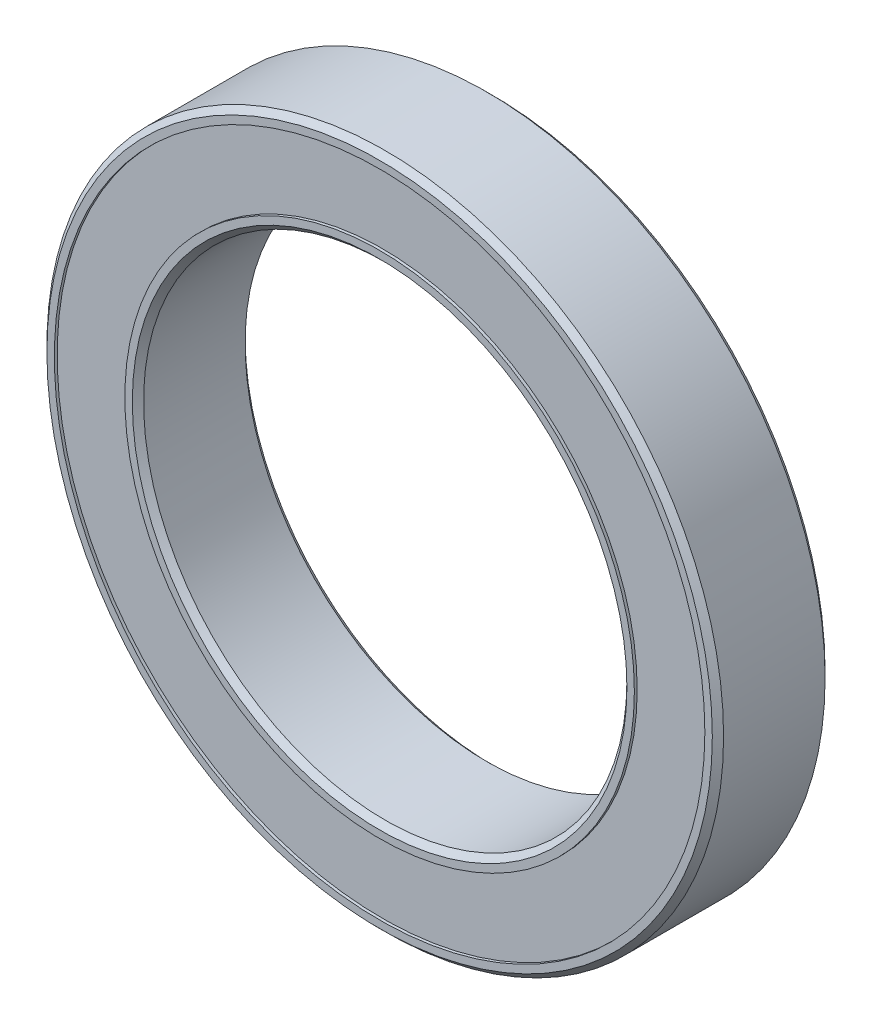
ISO-10303-21;
HEADER;
FILE_DESCRIPTION(('STEP AP214'),'2;1');
FILE_NAME('part.step','',(''),(''),'','','');
FILE_SCHEMA(('AUTOMOTIVE_DESIGN { 1 0 10303 214 1 1 1 1 }'));
ENDSEC;
DATA;
#1=APPLICATION_CONTEXT('core data for automotive mechanical design processes');
#2=APPLICATION_PROTOCOL_DEFINITION('international standard','automotive_design',2000,#1);
#3=PRODUCT_CONTEXT('',#1,'mechanical');
#4=PRODUCT('Part','Part','',(#3));
#5=PRODUCT_RELATED_PRODUCT_CATEGORY('part','',(#4));
#6=PRODUCT_DEFINITION_FORMATION('','',#4);
#7=PRODUCT_DEFINITION_CONTEXT('part definition',#1,'design');
#8=PRODUCT_DEFINITION('design','',#6,#7);
#9=PRODUCT_DEFINITION_SHAPE('','',#8);
#10=(LENGTH_UNIT() NAMED_UNIT(*) SI_UNIT(.MILLI.,.METRE.));
#11=(NAMED_UNIT(*) PLANE_ANGLE_UNIT() SI_UNIT($,.RADIAN.));
#12=(NAMED_UNIT(*) SI_UNIT($,.STERADIAN.) SOLID_ANGLE_UNIT());
#13=UNCERTAINTY_MEASURE_WITH_UNIT(LENGTH_MEASURE(1.E-05),#10,'distance_accuracy_value','');
#14=(GEOMETRIC_REPRESENTATION_CONTEXT(3) GLOBAL_UNCERTAINTY_ASSIGNED_CONTEXT((#13)) GLOBAL_UNIT_ASSIGNED_CONTEXT((#10,
#11,#12)) REPRESENTATION_CONTEXT('',''));
#15=CARTESIAN_POINT('',(0.,0.,0.));
#16=DIRECTION('',(0.,0.,1.));
#17=DIRECTION('',(1.,0.,0.));
#18=AXIS2_PLACEMENT_3D('',#15,#16,#17);
#19=CARTESIAN_POINT('',(0.,20.18725,3.325));
#20=DIRECTION('',(0.,0.,-1.));
#21=DIRECTION('',(1.,0.,0.));
#22=AXIS2_PLACEMENT_3D('',#19,#20,#21);
#23=PLANE('',#22);
#24=CARTESIAN_POINT('',(0.,0.,3.325));
#25=DIRECTION('',(0.,0.,1.));
#26=DIRECTION('',(1.,0.,0.));
#27=AXIS2_PLACEMENT_3D('',#24,#25,#26);
#28=CIRCLE('',#27,20.18725);
#29=CARTESIAN_POINT('',(20.18725,0.,3.325));
#30=VERTEX_POINT('',#29);
#31=EDGE_CURVE('E64',#30,#30,#28,.T.);
#32=ORIENTED_EDGE('',*,*,#31,.T.);
#33=EDGE_LOOP('',(#32));
#34=FACE_BOUND('',#33,.T.);
#35=CARTESIAN_POINT('',(0.,0.,3.325));
#36=DIRECTION('',(0.,0.,1.));
#37=DIRECTION('',(1.,0.,0.));
#38=AXIS2_PLACEMENT_3D('',#35,#36,#37);
#39=CIRCLE('',#38,15.81225);
#40=CARTESIAN_POINT('',(15.81225,0.,3.325));
#41=VERTEX_POINT('',#40);
#42=EDGE_CURVE('E11',#41,#41,#39,.T.);
#43=ORIENTED_EDGE('',*,*,#42,.F.);
#44=EDGE_LOOP('',(#43));
#45=FACE_BOUND('',#44,.T.);
#46=ADVANCED_FACE('F50',(#34,#45),#23,.F.);
#47=CARTESIAN_POINT('',(0.,0.,-3.5));
#48=DIRECTION('',(0.,0.,-1.));
#49=DIRECTION('',(1.,0.,0.));
#50=AXIS2_PLACEMENT_3D('',#47,#48,#49);
#51=CYLINDRICAL_SURFACE('',#50,15.81225);
#52=ORIENTED_EDGE('',*,*,#42,.T.);
#53=EDGE_LOOP('',(#52));
#54=FACE_BOUND('',#53,.T.);
#55=CARTESIAN_POINT('',(0.,0.,2.68419621794304));
#56=DIRECTION('',(0.,0.,1.));
#57=DIRECTION('',(1.,0.,0.));
#58=AXIS2_PLACEMENT_3D('',#55,#56,#57);
#59=CIRCLE('',#58,15.81225);
#60=CARTESIAN_POINT('',(15.81225,0.,2.68419621794304));
#61=VERTEX_POINT('',#60);
#62=EDGE_CURVE('E56',#61,#61,#59,.T.);
#63=ORIENTED_EDGE('',*,*,#62,.F.);
#64=EDGE_LOOP('',(#63));
#65=FACE_BOUND('',#64,.T.);
#66=ADVANCED_FACE('F80',(#54,#65),#51,.F.);
#67=CARTESIAN_POINT('',(0.,20.18725,2.68419621794304));
#68=DIRECTION('',(0.,0.,1.));
#69=DIRECTION('',(-1.,0.,0.));
#70=AXIS2_PLACEMENT_3D('',#67,#68,#69);
#71=PLANE('',#70);
#72=ORIENTED_EDGE('',*,*,#62,.T.);
#73=EDGE_LOOP('',(#72));
#74=FACE_BOUND('',#73,.T.);
#75=CARTESIAN_POINT('',(0.,0.,2.68419621794304));
#76=DIRECTION('',(0.,0.,1.));
#77=DIRECTION('',(1.,0.,0.));
#78=AXIS2_PLACEMENT_3D('',#75,#76,#77);
#79=CIRCLE('',#78,20.18725);
#80=CARTESIAN_POINT('',(20.18725,0.,2.68419621794304));
#81=VERTEX_POINT('',#80);
#82=EDGE_CURVE('E60',#81,#81,#79,.T.);
#83=ORIENTED_EDGE('',*,*,#82,.F.);
#84=EDGE_LOOP('',(#83));
#85=FACE_BOUND('',#84,.T.);
#86=ADVANCED_FACE('F74',(#74,#85),#71,.F.);
#87=CARTESIAN_POINT('',(0.,0.,-3.5));
#88=DIRECTION('',(0.,0.,-1.));
#89=DIRECTION('',(1.,0.,0.));
#90=AXIS2_PLACEMENT_3D('',#87,#88,#89);
#91=CYLINDRICAL_SURFACE('',#90,20.18725);
#92=ORIENTED_EDGE('',*,*,#82,.T.);
#93=EDGE_LOOP('',(#92));
#94=FACE_BOUND('',#93,.T.);
#95=ORIENTED_EDGE('',*,*,#31,.F.);
#96=EDGE_LOOP('',(#95));
#97=FACE_BOUND('',#96,.T.);
#98=ADVANCED_FACE('F72',(#94,#97),#91,.T.);
#99=CLOSED_SHELL('',(#46,#66,#86,#98));
#100=MANIFOLD_SOLID_BREP('B2',#99);
#101=CARTESIAN_POINT('',(0.,20.18725,-3.325));
#102=DIRECTION('',(0.,0.,1.));
#103=DIRECTION('',(-1.,0.,0.));
#104=AXIS2_PLACEMENT_3D('',#101,#102,#103);
#105=PLANE('',#104);
#106=CARTESIAN_POINT('',(0.,0.,-3.325));
#107=DIRECTION('',(0.,0.,1.));
#108=DIRECTION('',(1.,0.,0.));
#109=AXIS2_PLACEMENT_3D('',#106,#107,#108);
#110=CIRCLE('',#109,15.81225);
#111=CARTESIAN_POINT('',(15.81225,0.,-3.325));
#112=VERTEX_POINT('',#111);
#113=EDGE_CURVE('E49',#112,#112,#110,.T.);
#114=ORIENTED_EDGE('',*,*,#113,.T.);
#115=EDGE_LOOP('',(#114));
#116=FACE_BOUND('',#115,.T.);
#117=CARTESIAN_POINT('',(0.,0.,-3.325));
#118=DIRECTION('',(0.,0.,1.));
#119=DIRECTION('',(1.,0.,0.));
#120=AXIS2_PLACEMENT_3D('',#117,#118,#119);
#121=CIRCLE('',#120,20.18725);
#122=CARTESIAN_POINT('',(20.18725,0.,-3.325));
#123=VERTEX_POINT('',#122);
#124=EDGE_CURVE('E132',#123,#123,#121,.T.);
#125=ORIENTED_EDGE('',*,*,#124,.F.);
#126=EDGE_LOOP('',(#125));
#127=FACE_BOUND('',#126,.T.);
#128=ADVANCED_FACE('F118',(#116,#127),#105,.F.);
#129=CARTESIAN_POINT('',(0.,0.,-3.5));
#130=DIRECTION('',(0.,0.,-1.));
#131=DIRECTION('',(1.,0.,0.));
#132=AXIS2_PLACEMENT_3D('',#129,#130,#131);
#133=CYLINDRICAL_SURFACE('',#132,15.81225);
#134=CARTESIAN_POINT('',(0.,0.,-2.68419621794304));
#135=DIRECTION('',(0.,0.,1.));
#136=DIRECTION('',(1.,0.,0.));
#137=AXIS2_PLACEMENT_3D('',#134,#135,#136);
#138=CIRCLE('',#137,15.81225);
#139=CARTESIAN_POINT('',(15.81225,0.,-2.68419621794304));
#140=VERTEX_POINT('',#139);
#141=EDGE_CURVE('E124',#140,#140,#138,.T.);
#142=ORIENTED_EDGE('',*,*,#141,.T.);
#143=EDGE_LOOP('',(#142));
#144=FACE_BOUND('',#143,.T.);
#145=ORIENTED_EDGE('',*,*,#113,.F.);
#146=EDGE_LOOP('',(#145));
#147=FACE_BOUND('',#146,.T.);
#148=ADVANCED_FACE('F142',(#144,#147),#133,.F.);
#149=CARTESIAN_POINT('',(0.,20.18725,-2.68419621794304));
#150=DIRECTION('',(0.,0.,-1.));
#151=DIRECTION('',(1.,0.,0.));
#152=AXIS2_PLACEMENT_3D('',#149,#150,#151);
#153=PLANE('',#152);
#154=CARTESIAN_POINT('',(0.,0.,-2.68419621794304));
#155=DIRECTION('',(0.,0.,1.));
#156=DIRECTION('',(1.,0.,0.));
#157=AXIS2_PLACEMENT_3D('',#154,#155,#156);
#158=CIRCLE('',#157,20.18725);
#159=CARTESIAN_POINT('',(20.18725,0.,-2.68419621794304));
#160=VERTEX_POINT('',#159);
#161=EDGE_CURVE('E128',#160,#160,#158,.T.);
#162=ORIENTED_EDGE('',*,*,#161,.T.);
#163=EDGE_LOOP('',(#162));
#164=FACE_BOUND('',#163,.T.);
#165=ORIENTED_EDGE('',*,*,#141,.F.);
#166=EDGE_LOOP('',(#165));
#167=FACE_BOUND('',#166,.T.);
#168=ADVANCED_FACE('F146',(#164,#167),#153,.F.);
#169=CARTESIAN_POINT('',(0.,0.,-3.5));
#170=DIRECTION('',(0.,0.,-1.));
#171=DIRECTION('',(1.,0.,0.));
#172=AXIS2_PLACEMENT_3D('',#169,#170,#171);
#173=CYLINDRICAL_SURFACE('',#172,20.18725);
#174=ORIENTED_EDGE('',*,*,#124,.T.);
#175=EDGE_LOOP('',(#174));
#176=FACE_BOUND('',#175,.T.);
#177=ORIENTED_EDGE('',*,*,#161,.F.);
#178=EDGE_LOOP('',(#177));
#179=FACE_BOUND('',#178,.T.);
#180=ADVANCED_FACE('F138',(#176,#179),#173,.T.);
#181=CLOSED_SHELL('',(#128,#148,#168,#180));
#182=MANIFOLD_SOLID_BREP('B6',#181);
#183=CARTESIAN_POINT('',(-8.9998749999998,15.5882407617691,0.));
#184=DIRECTION('',(0.,0.,-1.));
#185=DIRECTION('',(-0.499999999999989,0.866025403784445,0.));
#186=AXIS2_PLACEMENT_3D('',#183,#184,#185);
#187=SPHERICAL_SURFACE('',#186,2.68419621794304);
#188=CARTESIAN_POINT('',(-8.9998749999998,15.5882407617691,-2.68419621794304));
#189=VERTEX_POINT('',#188);
#190=VERTEX_LOOP('',#189);
#191=FACE_BOUND('',#190,.T.);
#192=ADVANCED_FACE('F186',(#191),#187,.T.);
#193=CLOSED_SHELL('',(#192));
#194=MANIFOLD_SOLID_BREP('B44',#193);
#195=CARTESIAN_POINT('',(-15.5882407617688,8.99987500000018,0.));
#196=DIRECTION('',(0.,0.,-1.));
#197=DIRECTION('',(-0.866025403784433,0.50000000000001,0.));
#198=AXIS2_PLACEMENT_3D('',#195,#196,#197);
#199=SPHERICAL_SURFACE('',#198,2.68419621794304);
#200=CARTESIAN_POINT('',(-15.5882407617688,8.99987500000018,-2.68419621794304));
#201=VERTEX_POINT('',#200);
#202=VERTEX_LOOP('',#201);
#203=FACE_BOUND('',#202,.T.);
#204=ADVANCED_FACE('F207',(#203),#199,.T.);
#205=CLOSED_SHELL('',(#204));
#206=MANIFOLD_SOLID_BREP('B114',#205);
#207=CARTESIAN_POINT('',(-17.99975,1.88537373686525E-13,0.));
#208=DIRECTION('',(0.,0.,-1.));
#209=DIRECTION('',(-1.,0.,0.));
#210=AXIS2_PLACEMENT_3D('',#207,#208,#209);
#211=SPHERICAL_SURFACE('',#210,2.68419621794304);
#212=CARTESIAN_POINT('',(-17.99975,1.88537373686525E-13,-2.68419621794304));
#213=VERTEX_POINT('',#212);
#214=VERTEX_LOOP('',#213);
#215=FACE_BOUND('',#214,.T.);
#216=ADVANCED_FACE('F228',(#215),#211,.T.);
#217=CLOSED_SHELL('',(#216));
#218=MANIFOLD_SOLID_BREP('B182',#217);
#219=CARTESIAN_POINT('',(-15.588240761769,-8.99987499999986,0.));
#220=DIRECTION('',(0.,0.,-1.));
#221=DIRECTION('',(-0.866025403784443,-0.499999999999992,0.));
#222=AXIS2_PLACEMENT_3D('',#219,#220,#221);
#223=SPHERICAL_SURFACE('',#222,2.68419621794304);
#224=CARTESIAN_POINT('',(-15.588240761769,-8.99987499999986,-2.68419621794304));
#225=VERTEX_POINT('',#224);
#226=VERTEX_LOOP('',#225);
#227=FACE_BOUND('',#226,.T.);
#228=ADVANCED_FACE('F249',(#227),#223,.T.);
#229=CLOSED_SHELL('',(#228));
#230=MANIFOLD_SOLID_BREP('B203',#229);
#231=CARTESIAN_POINT('',(-8.99987500000013,-15.5882407617689,0.));
#232=DIRECTION('',(0.,0.,-1.));
#233=DIRECTION('',(-0.500000000000007,-0.866025403784435,0.));
#234=AXIS2_PLACEMENT_3D('',#231,#232,#233);
#235=SPHERICAL_SURFACE('',#234,2.68419621794304);
#236=CARTESIAN_POINT('',(-8.99987500000013,-15.5882407617689,-2.68419621794304));
#237=VERTEX_POINT('',#236);
#238=VERTEX_LOOP('',#237);
#239=FACE_BOUND('',#238,.T.);
#240=ADVANCED_FACE('F270',(#239),#235,.T.);
#241=CLOSED_SHELL('',(#240));
#242=MANIFOLD_SOLID_BREP('B224',#241);
#243=CARTESIAN_POINT('',(-1.25691582457683E-13,-17.99975,0.));
#244=DIRECTION('',(0.,0.,-1.));
#245=DIRECTION('',(0.,-1.,0.));
#246=AXIS2_PLACEMENT_3D('',#243,#244,#245);
#247=SPHERICAL_SURFACE('',#246,2.68419621794304);
#248=CARTESIAN_POINT('',(-1.25691582457683E-13,-17.99975,-2.68419621794304));
#249=VERTEX_POINT('',#248);
#250=VERTEX_LOOP('',#249);
#251=FACE_BOUND('',#250,.T.);
#252=ADVANCED_FACE('F291',(#251),#247,.T.);
#253=CLOSED_SHELL('',(#252));
#254=MANIFOLD_SOLID_BREP('B245',#253);
#255=CARTESIAN_POINT('',(8.99987499999991,-15.588240761769,0.));
#256=DIRECTION('',(0.,0.,-1.));
#257=DIRECTION('',(0.499999999999995,-0.866025403784442,0.));
#258=AXIS2_PLACEMENT_3D('',#255,#256,#257);
#259=SPHERICAL_SURFACE('',#258,2.68419621794304);
#260=CARTESIAN_POINT('',(8.99987499999991,-15.588240761769,-2.68419621794304));
#261=VERTEX_POINT('',#260);
#262=VERTEX_LOOP('',#261);
#263=FACE_BOUND('',#262,.T.);
#264=ADVANCED_FACE('F312',(#263),#259,.T.);
#265=CLOSED_SHELL('',(#264));
#266=MANIFOLD_SOLID_BREP('B266',#265);
#267=CARTESIAN_POINT('',(15.5882407617689,-8.99987500000008,0.));
#268=DIRECTION('',(0.,0.,-1.));
#269=DIRECTION('',(0.866025403784436,-0.500000000000004,0.));
#270=AXIS2_PLACEMENT_3D('',#267,#268,#269);
#271=SPHERICAL_SURFACE('',#270,2.68419621794304);
#272=CARTESIAN_POINT('',(15.5882407617689,-8.99987500000008,-2.68419621794304));
#273=VERTEX_POINT('',#272);
#274=VERTEX_LOOP('',#273);
#275=FACE_BOUND('',#274,.T.);
#276=ADVANCED_FACE('F333',(#275),#271,.T.);
#277=CLOSED_SHELL('',(#276));
#278=MANIFOLD_SOLID_BREP('B287',#277);
#279=CARTESIAN_POINT('',(17.99975,0.,0.));
#280=DIRECTION('',(0.,0.,-1.));
#281=DIRECTION('',(1.,0.,0.));
#282=AXIS2_PLACEMENT_3D('',#279,#280,#281);
#283=SPHERICAL_SURFACE('',#282,2.68419621794304);
#284=CARTESIAN_POINT('',(17.99975,0.,-2.68419621794304));
#285=VERTEX_POINT('',#284);
#286=VERTEX_LOOP('',#285);
#287=FACE_BOUND('',#286,.T.);
#288=ADVANCED_FACE('F354',(#287),#283,.T.);
#289=CLOSED_SHELL('',(#288));
#290=MANIFOLD_SOLID_BREP('B308',#289);
#291=CARTESIAN_POINT('',(15.588240761769,8.99987499999996,0.));
#292=DIRECTION('',(0.,0.,-1.));
#293=DIRECTION('',(0.86602540378444,0.499999999999998,0.));
#294=AXIS2_PLACEMENT_3D('',#291,#292,#293);
#295=SPHERICAL_SURFACE('',#294,2.68419621794304);
#296=CARTESIAN_POINT('',(15.588240761769,8.99987499999996,-2.68419621794304));
#297=VERTEX_POINT('',#296);
#298=VERTEX_LOOP('',#297);
#299=FACE_BOUND('',#298,.T.);
#300=ADVANCED_FACE('F375',(#299),#295,.T.);
#301=CLOSED_SHELL('',(#300));
#302=MANIFOLD_SOLID_BREP('B329',#301);
#303=CARTESIAN_POINT('',(8.99987500000002,15.5882407617689,0.));
#304=DIRECTION('',(0.,0.,-1.));
#305=DIRECTION('',(0.500000000000001,0.866025403784438,0.));
#306=AXIS2_PLACEMENT_3D('',#303,#304,#305);
#307=SPHERICAL_SURFACE('',#306,2.68419621794304);
#308=CARTESIAN_POINT('',(8.99987500000002,15.5882407617689,-2.68419621794304));
#309=VERTEX_POINT('',#308);
#310=VERTEX_LOOP('',#309);
#311=FACE_BOUND('',#310,.T.);
#312=ADVANCED_FACE('F396',(#311),#307,.T.);
#313=CLOSED_SHELL('',(#312));
#314=MANIFOLD_SOLID_BREP('B350',#313);
#315=CARTESIAN_POINT('',(0.,17.99975,0.));
#316=DIRECTION('',(0.,0.,-1.));
#317=DIRECTION('',(0.,1.,0.));
#318=AXIS2_PLACEMENT_3D('',#315,#316,#317);
#319=SPHERICAL_SURFACE('',#318,2.68419621794304);
#320=CARTESIAN_POINT('',(0.,17.99975,-2.68419621794304));
#321=VERTEX_POINT('',#320);
#322=VERTEX_LOOP('',#321);
#323=FACE_BOUND('',#322,.T.);
#324=ADVANCED_FACE('F419',(#323),#319,.T.);
#325=CLOSED_SHELL('',(#324));
#326=MANIFOLD_SOLID_BREP('B371',#325);
#327=CARTESIAN_POINT('',(0.,0.,-3.5));
#328=DIRECTION('',(0.,0.,-1.));
#329=DIRECTION('',(1.,0.,0.));
#330=AXIS2_PLACEMENT_3D('',#327,#328,#329);
#331=CONICAL_SURFACE('',#330,15.3495,0.78539816339745);
#332=CARTESIAN_POINT('',(0.,0.,-3.15));
#333=DIRECTION('',(0.,0.,1.));
#334=DIRECTION('',(1.,0.,0.));
#335=AXIS2_PLACEMENT_3D('',#332,#333,#334);
#336=CIRCLE('',#335,14.9995);
#337=CARTESIAN_POINT('',(14.9995,0.,-3.15));
#338=VERTEX_POINT('',#337);
#339=EDGE_CURVE('E418',#338,#338,#336,.T.);
#340=ORIENTED_EDGE('',*,*,#339,.T.);
#341=EDGE_LOOP('',(#340));
#342=FACE_BOUND('',#341,.T.);
#343=CARTESIAN_POINT('',(0.,0.,-3.5));
#344=DIRECTION('',(0.,0.,1.));
#345=DIRECTION('',(1.,0.,0.));
#346=AXIS2_PLACEMENT_3D('',#343,#344,#345);
#347=CIRCLE('',#346,15.3495);
#348=CARTESIAN_POINT('',(15.3495,0.,-3.5));
#349=VERTEX_POINT('',#348);
#350=EDGE_CURVE('E467',#349,#349,#347,.T.);
#351=ORIENTED_EDGE('',*,*,#350,.F.);
#352=EDGE_LOOP('',(#351));
#353=FACE_BOUND('',#352,.T.);
#354=ADVANCED_FACE('F439',(#342,#353),#331,.F.);
#355=CARTESIAN_POINT('',(0.,0.,-3.5));
#356=DIRECTION('',(0.,0.,-1.));
#357=DIRECTION('',(1.,0.,0.));
#358=AXIS2_PLACEMENT_3D('',#355,#356,#357);
#359=CYLINDRICAL_SURFACE('',#358,14.9995);
#360=CARTESIAN_POINT('',(0.,0.,3.15));
#361=DIRECTION('',(0.,0.,1.));
#362=DIRECTION('',(1.,0.,0.));
#363=AXIS2_PLACEMENT_3D('',#360,#361,#362);
#364=CIRCLE('',#363,14.9995);
#365=CARTESIAN_POINT('',(14.9995,0.,3.15));
#366=VERTEX_POINT('',#365);
#367=EDGE_CURVE('E445',#366,#366,#364,.T.);
#368=ORIENTED_EDGE('',*,*,#367,.T.);
#369=EDGE_LOOP('',(#368));
#370=FACE_BOUND('',#369,.T.);
#371=ORIENTED_EDGE('',*,*,#339,.F.);
#372=EDGE_LOOP('',(#371));
#373=FACE_BOUND('',#372,.T.);
#374=ADVANCED_FACE('F475',(#370,#373),#359,.F.);
#375=CARTESIAN_POINT('',(0.,0.,3.15));
#376=DIRECTION('',(0.,0.,1.));
#377=DIRECTION('',(-1.,0.,0.));
#378=AXIS2_PLACEMENT_3D('',#375,#376,#377);
#379=CONICAL_SURFACE('',#378,14.9995,0.785398163397451);
#380=CARTESIAN_POINT('',(0.,0.,3.5));
#381=DIRECTION('',(0.,0.,1.));
#382=DIRECTION('',(1.,0.,0.));
#383=AXIS2_PLACEMENT_3D('',#380,#381,#382);
#384=CIRCLE('',#383,15.3495);
#385=CARTESIAN_POINT('',(15.3495,0.,3.5));
#386=VERTEX_POINT('',#385);
#387=EDGE_CURVE('E449',#386,#386,#384,.T.);
#388=ORIENTED_EDGE('',*,*,#387,.T.);
#389=EDGE_LOOP('',(#388));
#390=FACE_BOUND('',#389,.T.);
#391=ORIENTED_EDGE('',*,*,#367,.F.);
#392=EDGE_LOOP('',(#391));
#393=FACE_BOUND('',#392,.T.);
#394=ADVANCED_FACE('F479',(#390,#393),#379,.F.);
#395=CARTESIAN_POINT('',(0.,15.3495,3.5));
#396=DIRECTION('',(0.,0.,-1.));
#397=DIRECTION('',(1.,0.,0.));
#398=AXIS2_PLACEMENT_3D('',#395,#396,#397);
#399=PLANE('',#398);
#400=CARTESIAN_POINT('',(0.,0.,3.5));
#401=DIRECTION('',(0.,0.,1.));
#402=DIRECTION('',(1.,0.,0.));
#403=AXIS2_PLACEMENT_3D('',#400,#401,#402);
#404=CIRCLE('',#403,15.81225);
#405=CARTESIAN_POINT('',(15.81225,0.,3.5));
#406=VERTEX_POINT('',#405);
#407=EDGE_CURVE('E453',#406,#406,#404,.T.);
#408=ORIENTED_EDGE('',*,*,#407,.T.);
#409=EDGE_LOOP('',(#408));
#410=FACE_BOUND('',#409,.T.);
#411=ORIENTED_EDGE('',*,*,#387,.F.);
#412=EDGE_LOOP('',(#411));
#413=FACE_BOUND('',#412,.T.);
#414=ADVANCED_FACE('F483',(#410,#413),#399,.F.);
#415=CARTESIAN_POINT('',(0.,0.,-3.5));
#416=DIRECTION('',(0.,0.,-1.));
#417=DIRECTION('',(1.,0.,0.));
#418=AXIS2_PLACEMENT_3D('',#415,#416,#417);
#419=CYLINDRICAL_SURFACE('',#418,15.81225);
#420=CARTESIAN_POINT('',(0.,0.,1.55555555555555));
#421=DIRECTION('',(0.,0.,1.));
#422=DIRECTION('',(1.,0.,0.));
#423=AXIS2_PLACEMENT_3D('',#420,#421,#422);
#424=CIRCLE('',#423,15.81225);
#425=CARTESIAN_POINT('',(15.81225,0.,1.55555555555555));
#426=VERTEX_POINT('',#425);
#427=EDGE_CURVE('E458',#426,#426,#424,.T.);
#428=ORIENTED_EDGE('',*,*,#427,.T.);
#429=EDGE_LOOP('',(#428));
#430=FACE_BOUND('',#429,.T.);
#431=ORIENTED_EDGE('',*,*,#407,.F.);
#432=EDGE_LOOP('',(#431));
#433=FACE_BOUND('',#432,.T.);
#434=ADVANCED_FACE('F490',(#430,#433),#419,.T.);
#435=CARTESIAN_POINT('',(0.,0.,0.));
#436=DIRECTION('',(0.,0.,-1.));
#437=DIRECTION('',(1.,0.,0.));
#438=AXIS2_PLACEMENT_3D('',#435,#436,#437);
#439=TOROIDAL_SURFACE('',#438,17.99975,2.68419621794304);
#440=CARTESIAN_POINT('',(0.,0.,-1.55555555555556));
#441=DIRECTION('',(0.,0.,1.));
#442=DIRECTION('',(1.,0.,0.));
#443=AXIS2_PLACEMENT_3D('',#440,#441,#442);
#444=CIRCLE('',#443,15.81225);
#445=CARTESIAN_POINT('',(15.81225,0.,-1.55555555555556));
#446=VERTEX_POINT('',#445);
#447=EDGE_CURVE('E461',#446,#446,#444,.T.);
#448=ORIENTED_EDGE('',*,*,#447,.T.);
#449=EDGE_LOOP('',(#448));
#450=FACE_BOUND('',#449,.T.);
#451=ORIENTED_EDGE('',*,*,#427,.F.);
#452=EDGE_LOOP('',(#451));
#453=FACE_BOUND('',#452,.T.);
#454=ADVANCED_FACE('F494',(#450,#453),#439,.F.);
#455=CARTESIAN_POINT('',(0.,0.,-3.5));
#456=DIRECTION('',(0.,0.,-1.));
#457=DIRECTION('',(1.,0.,0.));
#458=AXIS2_PLACEMENT_3D('',#455,#456,#457);
#459=CYLINDRICAL_SURFACE('',#458,15.81225);
#460=CARTESIAN_POINT('',(0.,0.,-3.5));
#461=DIRECTION('',(0.,0.,1.));
#462=DIRECTION('',(1.,0.,0.));
#463=AXIS2_PLACEMENT_3D('',#460,#461,#462);
#464=CIRCLE('',#463,15.81225);
#465=CARTESIAN_POINT('',(15.81225,0.,-3.5));
#466=VERTEX_POINT('',#465);
#467=EDGE_CURVE('E464',#466,#466,#464,.T.);
#468=ORIENTED_EDGE('',*,*,#467,.T.);
#469=EDGE_LOOP('',(#468));
#470=FACE_BOUND('',#469,.T.);
#471=ORIENTED_EDGE('',*,*,#447,.F.);
#472=EDGE_LOOP('',(#471));
#473=FACE_BOUND('',#472,.T.);
#474=ADVANCED_FACE('F498',(#470,#473),#459,.T.);
#475=CARTESIAN_POINT('',(0.,15.3495,-3.5));
#476=DIRECTION('',(0.,0.,1.));
#477=DIRECTION('',(-1.,0.,0.));
#478=AXIS2_PLACEMENT_3D('',#475,#476,#477);
#479=PLANE('',#478);
#480=ORIENTED_EDGE('',*,*,#350,.T.);
#481=EDGE_LOOP('',(#480));
#482=FACE_BOUND('',#481,.T.);
#483=ORIENTED_EDGE('',*,*,#467,.F.);
#484=EDGE_LOOP('',(#483));
#485=FACE_BOUND('',#484,.T.);
#486=ADVANCED_FACE('F471',(#482,#485),#479,.F.);
#487=CLOSED_SHELL('',(#354,#374,#394,#414,#434,#454,#474,#486));
#488=MANIFOLD_SOLID_BREP('B392',#487);
#489=CARTESIAN_POINT('',(0.,0.,-3.15));
#490=DIRECTION('',(0.,0.,1.));
#491=DIRECTION('',(-1.,0.,0.));
#492=AXIS2_PLACEMENT_3D('',#489,#490,#491);
#493=CONICAL_SURFACE('',#492,21.,0.785398163397448);
#494=CARTESIAN_POINT('',(0.,0.,-3.5));
#495=DIRECTION('',(0.,0.,1.));
#496=DIRECTION('',(1.,0.,0.));
#497=AXIS2_PLACEMENT_3D('',#494,#495,#496);
#498=CIRCLE('',#497,20.65);
#499=CARTESIAN_POINT('',(20.65,0.,-3.5));
#500=VERTEX_POINT('',#499);
#501=EDGE_CURVE('E438',#500,#500,#498,.T.);
#502=ORIENTED_EDGE('',*,*,#501,.T.);
#503=EDGE_LOOP('',(#502));
#504=FACE_BOUND('',#503,.T.);
#505=CARTESIAN_POINT('',(0.,0.,-3.15));
#506=DIRECTION('',(0.,0.,1.));
#507=DIRECTION('',(1.,0.,0.));
#508=AXIS2_PLACEMENT_3D('',#505,#506,#507);
#509=CIRCLE('',#508,21.);
#510=CARTESIAN_POINT('',(21.,0.,-3.15));
#511=VERTEX_POINT('',#510);
#512=EDGE_CURVE('E589',#511,#511,#509,.T.);
#513=ORIENTED_EDGE('',*,*,#512,.F.);
#514=EDGE_LOOP('',(#513));
#515=FACE_BOUND('',#514,.T.);
#516=ADVANCED_FACE('F561',(#504,#515),#493,.T.);
#517=CARTESIAN_POINT('',(0.,20.65,-3.5));
#518=DIRECTION('',(0.,0.,1.));
#519=DIRECTION('',(-1.,0.,0.));
#520=AXIS2_PLACEMENT_3D('',#517,#518,#519);
#521=PLANE('',#520);
#522=CARTESIAN_POINT('',(0.,0.,-3.5));
#523=DIRECTION('',(0.,0.,1.));
#524=DIRECTION('',(1.,0.,0.));
#525=AXIS2_PLACEMENT_3D('',#522,#523,#524);
#526=CIRCLE('',#525,20.18725);
#527=CARTESIAN_POINT('',(20.18725,0.,-3.5));
#528=VERTEX_POINT('',#527);
#529=EDGE_CURVE('E567',#528,#528,#526,.T.);
#530=ORIENTED_EDGE('',*,*,#529,.T.);
#531=EDGE_LOOP('',(#530));
#532=FACE_BOUND('',#531,.T.);
#533=ORIENTED_EDGE('',*,*,#501,.F.);
#534=EDGE_LOOP('',(#533));
#535=FACE_BOUND('',#534,.T.);
#536=ADVANCED_FACE('F597',(#532,#535),#521,.F.);
#537=CARTESIAN_POINT('',(0.,0.,-3.5));
#538=DIRECTION('',(0.,0.,-1.));
#539=DIRECTION('',(1.,0.,0.));
#540=AXIS2_PLACEMENT_3D('',#537,#538,#539);
#541=CYLINDRICAL_SURFACE('',#540,20.18725);
#542=CARTESIAN_POINT('',(0.,0.,-1.55555555555556));
#543=DIRECTION('',(0.,0.,1.));
#544=DIRECTION('',(1.,0.,0.));
#545=AXIS2_PLACEMENT_3D('',#542,#543,#544);
#546=CIRCLE('',#545,20.18725);
#547=CARTESIAN_POINT('',(20.18725,0.,-1.55555555555556));
#548=VERTEX_POINT('',#547);
#549=EDGE_CURVE('E571',#548,#548,#546,.T.);
#550=ORIENTED_EDGE('',*,*,#549,.T.);
#551=EDGE_LOOP('',(#550));
#552=FACE_BOUND('',#551,.T.);
#553=ORIENTED_EDGE('',*,*,#529,.F.);
#554=EDGE_LOOP('',(#553));
#555=FACE_BOUND('',#554,.T.);
#556=ADVANCED_FACE('F601',(#552,#555),#541,.F.);
#557=CARTESIAN_POINT('',(0.,0.,0.));
#558=DIRECTION('',(0.,0.,-1.));
#559=DIRECTION('',(1.,0.,0.));
#560=AXIS2_PLACEMENT_3D('',#557,#558,#559);
#561=TOROIDAL_SURFACE('',#560,17.99975,2.68419621794304);
#562=CARTESIAN_POINT('',(0.,0.,1.55555555555556));
#563=DIRECTION('',(0.,0.,1.));
#564=DIRECTION('',(1.,0.,0.));
#565=AXIS2_PLACEMENT_3D('',#562,#563,#564);
#566=CIRCLE('',#565,20.18725);
#567=CARTESIAN_POINT('',(20.18725,0.,1.55555555555556));
#568=VERTEX_POINT('',#567);
#569=EDGE_CURVE('E575',#568,#568,#566,.T.);
#570=ORIENTED_EDGE('',*,*,#569,.T.);
#571=EDGE_LOOP('',(#570));
#572=FACE_BOUND('',#571,.T.);
#573=ORIENTED_EDGE('',*,*,#549,.F.);
#574=EDGE_LOOP('',(#573));
#575=FACE_BOUND('',#574,.T.);
#576=ADVANCED_FACE('F605',(#572,#575),#561,.F.);
#577=CARTESIAN_POINT('',(0.,0.,-3.5));
#578=DIRECTION('',(0.,0.,-1.));
#579=DIRECTION('',(1.,0.,0.));
#580=AXIS2_PLACEMENT_3D('',#577,#578,#579);
#581=CYLINDRICAL_SURFACE('',#580,20.18725);
#582=CARTESIAN_POINT('',(0.,0.,3.5));
#583=DIRECTION('',(0.,0.,1.));
#584=DIRECTION('',(1.,0.,0.));
#585=AXIS2_PLACEMENT_3D('',#582,#583,#584);
#586=CIRCLE('',#585,20.18725);
#587=CARTESIAN_POINT('',(20.18725,0.,3.5));
#588=VERTEX_POINT('',#587);
#589=EDGE_CURVE('E580',#588,#588,#586,.T.);
#590=ORIENTED_EDGE('',*,*,#589,.T.);
#591=EDGE_LOOP('',(#590));
#592=FACE_BOUND('',#591,.T.);
#593=ORIENTED_EDGE('',*,*,#569,.F.);
#594=EDGE_LOOP('',(#593));
#595=FACE_BOUND('',#594,.T.);
#596=ADVANCED_FACE('F612',(#592,#595),#581,.F.);
#597=CARTESIAN_POINT('',(0.,20.65,3.5));
#598=DIRECTION('',(0.,0.,-1.));
#599=DIRECTION('',(1.,0.,0.));
#600=AXIS2_PLACEMENT_3D('',#597,#598,#599);
#601=PLANE('',#600);
#602=CARTESIAN_POINT('',(0.,0.,3.5));
#603=DIRECTION('',(0.,0.,1.));
#604=DIRECTION('',(1.,0.,0.));
#605=AXIS2_PLACEMENT_3D('',#602,#603,#604);
#606=CIRCLE('',#605,20.65);
#607=CARTESIAN_POINT('',(20.65,0.,3.5));
#608=VERTEX_POINT('',#607);
#609=EDGE_CURVE('E583',#608,#608,#606,.T.);
#610=ORIENTED_EDGE('',*,*,#609,.T.);
#611=EDGE_LOOP('',(#610));
#612=FACE_BOUND('',#611,.T.);
#613=ORIENTED_EDGE('',*,*,#589,.F.);
#614=EDGE_LOOP('',(#613));
#615=FACE_BOUND('',#614,.T.);
#616=ADVANCED_FACE('F616',(#612,#615),#601,.F.);
#617=CARTESIAN_POINT('',(0.,0.,3.5));
#618=DIRECTION('',(0.,0.,-1.));
#619=DIRECTION('',(1.,0.,0.));
#620=AXIS2_PLACEMENT_3D('',#617,#618,#619);
#621=CONICAL_SURFACE('',#620,20.65,0.785398163397448);
#622=CARTESIAN_POINT('',(0.,0.,3.15));
#623=DIRECTION('',(0.,0.,1.));
#624=DIRECTION('',(1.,0.,0.));
#625=AXIS2_PLACEMENT_3D('',#622,#623,#624);
#626=CIRCLE('',#625,21.);
#627=CARTESIAN_POINT('',(21.,0.,3.15));
#628=VERTEX_POINT('',#627);
#629=EDGE_CURVE('E586',#628,#628,#626,.T.);
#630=ORIENTED_EDGE('',*,*,#629,.T.);
#631=EDGE_LOOP('',(#630));
#632=FACE_BOUND('',#631,.T.);
#633=ORIENTED_EDGE('',*,*,#609,.F.);
#634=EDGE_LOOP('',(#633));
#635=FACE_BOUND('',#634,.T.);
#636=ADVANCED_FACE('F620',(#632,#635),#621,.T.);
#637=CARTESIAN_POINT('',(0.,0.,-3.5));
#638=DIRECTION('',(0.,0.,-1.));
#639=DIRECTION('',(1.,0.,0.));
#640=AXIS2_PLACEMENT_3D('',#637,#638,#639);
#641=CYLINDRICAL_SURFACE('',#640,21.);
#642=ORIENTED_EDGE('',*,*,#512,.T.);
#643=EDGE_LOOP('',(#642));
#644=FACE_BOUND('',#643,.T.);
#645=ORIENTED_EDGE('',*,*,#629,.F.);
#646=EDGE_LOOP('',(#645));
#647=FACE_BOUND('',#646,.T.);
#648=ADVANCED_FACE('F593',(#644,#647),#641,.T.);
#649=CLOSED_SHELL('',(#516,#536,#556,#576,#596,#616,#636,#648));
#650=MANIFOLD_SOLID_BREP('B413',#649);
#651=ADVANCED_BREP_SHAPE_REPRESENTATION('',(#18,#100,#182,#194,#206,#218,#230,#242,#254,#266,
#278,#290,#302,#314,#326,#488,#650),#14);
#652=SHAPE_DEFINITION_REPRESENTATION(#9,#651);
ENDSEC;
END-ISO-10303-21;
